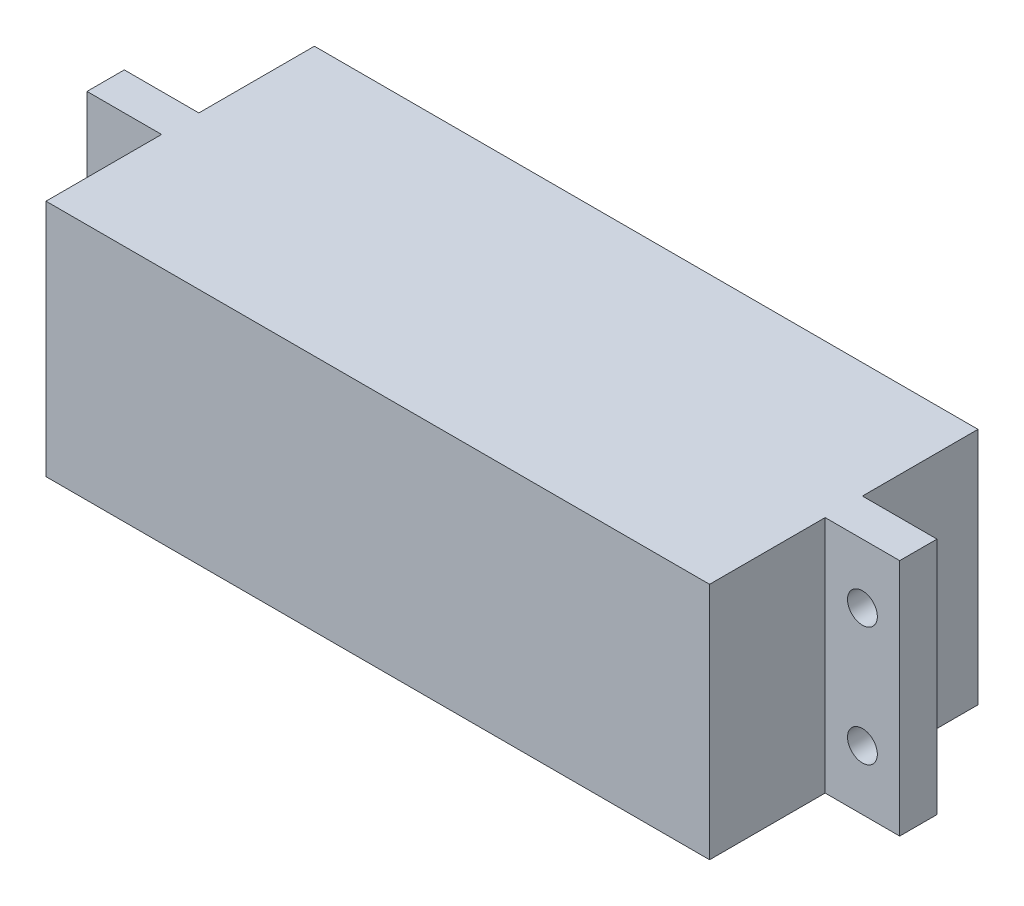
ISO-10303-21;
HEADER;
FILE_DESCRIPTION(('STEP AP214'),'2;1');
FILE_NAME('part.step','',(''),(''),'','','');
FILE_SCHEMA(('AUTOMOTIVE_DESIGN { 1 0 10303 214 1 1 1 1 }'));
ENDSEC;
DATA;
#1=APPLICATION_CONTEXT('core data for automotive mechanical design processes');
#2=APPLICATION_PROTOCOL_DEFINITION('international standard','automotive_design',2000,#1);
#3=PRODUCT_CONTEXT('',#1,'mechanical');
#4=PRODUCT('Part','Part','',(#3));
#5=PRODUCT_RELATED_PRODUCT_CATEGORY('part','',(#4));
#6=PRODUCT_DEFINITION_FORMATION('','',#4);
#7=PRODUCT_DEFINITION_CONTEXT('part definition',#1,'design');
#8=PRODUCT_DEFINITION('design','',#6,#7);
#9=PRODUCT_DEFINITION_SHAPE('','',#8);
#10=(LENGTH_UNIT() NAMED_UNIT(*) SI_UNIT(.MILLI.,.METRE.));
#11=(NAMED_UNIT(*) PLANE_ANGLE_UNIT() SI_UNIT($,.RADIAN.));
#12=(NAMED_UNIT(*) SI_UNIT($,.STERADIAN.) SOLID_ANGLE_UNIT());
#13=UNCERTAINTY_MEASURE_WITH_UNIT(LENGTH_MEASURE(1.E-05),#10,'distance_accuracy_value','');
#14=(GEOMETRIC_REPRESENTATION_CONTEXT(3) GLOBAL_UNCERTAINTY_ASSIGNED_CONTEXT((#13)) GLOBAL_UNIT_ASSIGNED_CONTEXT((#10,
#11,#12)) REPRESENTATION_CONTEXT('',''));
#15=CARTESIAN_POINT('',(0.,0.,0.));
#16=DIRECTION('',(0.,0.,1.));
#17=DIRECTION('',(1.,0.,0.));
#18=AXIS2_PLACEMENT_3D('',#15,#16,#17);
#19=CARTESIAN_POINT('',(-44.5,-30.,0.));
#20=DIRECTION('',(-1.,0.,0.));
#21=DIRECTION('',(0.,0.,1.));
#22=AXIS2_PLACEMENT_3D('',#19,#20,#21);
#23=PLANE('',#22);
#24=DIRECTION('',(0.,0.,-1.));
#25=VECTOR('',#24,1.);
#26=CARTESIAN_POINT('',(-44.5,2.,0.));
#27=LINE('',#26,#25);
#28=CARTESIAN_POINT('',(-44.5,2.,18.));
#29=VERTEX_POINT('',#28);
#30=CARTESIAN_POINT('',(-44.5,2.,2.5));
#31=VERTEX_POINT('',#30);
#32=EDGE_CURVE('E305',#29,#31,#27,.T.);
#33=ORIENTED_EDGE('',*,*,#32,.T.);
#34=DIRECTION('',(0.,-1.,0.));
#35=VECTOR('',#34,1.);
#36=CARTESIAN_POINT('',(-44.5,2.,2.5));
#37=LINE('',#36,#35);
#38=CARTESIAN_POINT('',(-44.5,-30.,2.5));
#39=VERTEX_POINT('',#38);
#40=EDGE_CURVE('E210',#31,#39,#37,.T.);
#41=ORIENTED_EDGE('',*,*,#40,.T.);
#42=DIRECTION('',(0.,0.,1.));
#43=VECTOR('',#42,1.);
#44=CARTESIAN_POINT('',(-44.5,-30.,0.));
#45=LINE('',#44,#43);
#46=CARTESIAN_POINT('',(-44.5,-30.,18.));
#47=VERTEX_POINT('',#46);
#48=EDGE_CURVE('E352',#39,#47,#45,.T.);
#49=ORIENTED_EDGE('',*,*,#48,.T.);
#50=DIRECTION('',(0.,1.,0.));
#51=VECTOR('',#50,1.);
#52=CARTESIAN_POINT('',(-44.5,-30.,18.));
#53=LINE('',#52,#51);
#54=EDGE_CURVE('E367',#47,#29,#53,.T.);
#55=ORIENTED_EDGE('',*,*,#54,.T.);
#56=EDGE_LOOP('',(#33,#41,#49,#55));
#57=FACE_BOUND('',#56,.T.);
#58=ADVANCED_FACE('F87',(#57),#23,.T.);
#59=CARTESIAN_POINT('',(-44.5,-30.,-18.));
#60=VERTEX_POINT('',#59);
#61=CARTESIAN_POINT('',(-44.5,-30.,-2.5));
#62=VERTEX_POINT('',#61);
#63=EDGE_CURVE('E353',#60,#62,#45,.T.);
#64=ORIENTED_EDGE('',*,*,#63,.T.);
#65=DIRECTION('',(0.,1.,0.));
#66=VECTOR('',#65,1.);
#67=CARTESIAN_POINT('',(-44.5,2.,-2.5));
#68=LINE('',#67,#66);
#69=CARTESIAN_POINT('',(-44.5,2.,-2.5));
#70=VERTEX_POINT('',#69);
#71=EDGE_CURVE('E226',#62,#70,#68,.T.);
#72=ORIENTED_EDGE('',*,*,#71,.T.);
#73=CARTESIAN_POINT('',(-44.5,2.,-18.));
#74=VERTEX_POINT('',#73);
#75=EDGE_CURVE('E304',#70,#74,#27,.T.);
#76=ORIENTED_EDGE('',*,*,#75,.T.);
#77=DIRECTION('',(0.,1.,0.));
#78=VECTOR('',#77,1.);
#79=CARTESIAN_POINT('',(-44.5,-30.,-18.));
#80=LINE('',#79,#78);
#81=EDGE_CURVE('E370',#60,#74,#80,.T.);
#82=ORIENTED_EDGE('',*,*,#81,.F.);
#83=EDGE_LOOP('',(#64,#72,#76,#82));
#84=FACE_BOUND('',#83,.T.);
#85=ADVANCED_FACE('F424',(#84),#23,.T.);
#86=CARTESIAN_POINT('',(44.5,-30.,0.));
#87=DIRECTION('',(1.,0.,0.));
#88=DIRECTION('',(0.,0.,-1.));
#89=AXIS2_PLACEMENT_3D('',#86,#87,#88);
#90=PLANE('',#89);
#91=DIRECTION('',(0.,-1.,0.));
#92=VECTOR('',#91,1.);
#93=CARTESIAN_POINT('',(44.5,2.,2.5));
#94=LINE('',#93,#92);
#95=CARTESIAN_POINT('',(44.5,2.,2.5));
#96=VERTEX_POINT('',#95);
#97=CARTESIAN_POINT('',(44.5,-30.,2.5));
#98=VERTEX_POINT('',#97);
#99=EDGE_CURVE('E274',#96,#98,#94,.T.);
#100=ORIENTED_EDGE('',*,*,#99,.F.);
#101=DIRECTION('',(0.,0.,1.));
#102=VECTOR('',#101,1.);
#103=CARTESIAN_POINT('',(44.5,2.,0.));
#104=LINE('',#103,#102);
#105=CARTESIAN_POINT('',(44.5,2.,18.));
#106=VERTEX_POINT('',#105);
#107=EDGE_CURVE('E296',#96,#106,#104,.T.);
#108=ORIENTED_EDGE('',*,*,#107,.T.);
#109=DIRECTION('',(0.,1.,0.));
#110=VECTOR('',#109,1.);
#111=CARTESIAN_POINT('',(44.5,-30.,18.));
#112=LINE('',#111,#110);
#113=CARTESIAN_POINT('',(44.5,-30.,18.));
#114=VERTEX_POINT('',#113);
#115=EDGE_CURVE('E362',#114,#106,#112,.T.);
#116=ORIENTED_EDGE('',*,*,#115,.F.);
#117=DIRECTION('',(0.,0.,-1.));
#118=VECTOR('',#117,1.);
#119=CARTESIAN_POINT('',(44.5,-30.,0.));
#120=LINE('',#119,#118);
#121=EDGE_CURVE('E345',#114,#98,#120,.T.);
#122=ORIENTED_EDGE('',*,*,#121,.T.);
#123=EDGE_LOOP('',(#100,#108,#116,#122));
#124=FACE_BOUND('',#123,.T.);
#125=ADVANCED_FACE('F430',(#124),#90,.T.);
#126=CARTESIAN_POINT('',(0.,2.,0.));
#127=DIRECTION('',(0.,-1.,0.));
#128=DIRECTION('',(0.,0.,-1.));
#129=AXIS2_PLACEMENT_3D('',#126,#127,#128);
#130=PLANE('',#129);
#131=DIRECTION('',(1.,0.,0.));
#132=VECTOR('',#131,1.);
#133=CARTESIAN_POINT('',(0.,2.,-18.));
#134=LINE('',#133,#132);
#135=CARTESIAN_POINT('',(44.5,2.,-18.));
#136=VERTEX_POINT('',#135);
#137=EDGE_CURVE('E300',#74,#136,#134,.T.);
#138=ORIENTED_EDGE('',*,*,#137,.F.);
#139=ORIENTED_EDGE('',*,*,#75,.F.);
#140=DIRECTION('',(1.,0.,0.));
#141=VECTOR('',#140,1.);
#142=CARTESIAN_POINT('',(-54.5,2.,-2.5));
#143=LINE('',#142,#141);
#144=CARTESIAN_POINT('',(-54.5,2.,-2.5));
#145=VERTEX_POINT('',#144);
#146=EDGE_CURVE('E105',#145,#70,#143,.T.);
#147=ORIENTED_EDGE('',*,*,#146,.F.);
#148=DIRECTION('',(0.,0.,1.));
#149=VECTOR('',#148,1.);
#150=CARTESIAN_POINT('',(-54.5,2.,2.5));
#151=LINE('',#150,#149);
#152=CARTESIAN_POINT('',(-54.5,2.,2.5));
#153=VERTEX_POINT('',#152);
#154=EDGE_CURVE('E222',#145,#153,#151,.T.);
#155=ORIENTED_EDGE('',*,*,#154,.T.);
#156=DIRECTION('',(1.,0.,0.));
#157=VECTOR('',#156,1.);
#158=CARTESIAN_POINT('',(-54.5,2.,2.5));
#159=LINE('',#158,#157);
#160=EDGE_CURVE('E204',#153,#31,#159,.T.);
#161=ORIENTED_EDGE('',*,*,#160,.T.);
#162=ORIENTED_EDGE('',*,*,#32,.F.);
#163=DIRECTION('',(-1.,0.,0.));
#164=VECTOR('',#163,1.);
#165=CARTESIAN_POINT('',(0.,2.,18.));
#166=LINE('',#165,#164);
#167=EDGE_CURVE('E308',#106,#29,#166,.T.);
#168=ORIENTED_EDGE('',*,*,#167,.F.);
#169=ORIENTED_EDGE('',*,*,#107,.F.);
#170=DIRECTION('',(-1.,0.,0.));
#171=VECTOR('',#170,1.);
#172=CARTESIAN_POINT('',(54.5,2.,2.5));
#173=LINE('',#172,#171);
#174=CARTESIAN_POINT('',(54.5,2.,2.5));
#175=VERTEX_POINT('',#174);
#176=EDGE_CURVE('E273',#175,#96,#173,.T.);
#177=ORIENTED_EDGE('',*,*,#176,.F.);
#178=DIRECTION('',(0.,0.,1.));
#179=VECTOR('',#178,1.);
#180=CARTESIAN_POINT('',(54.5,2.,2.5));
#181=LINE('',#180,#179);
#182=CARTESIAN_POINT('',(54.5,2.,-2.5));
#183=VERTEX_POINT('',#182);
#184=EDGE_CURVE('E270',#183,#175,#181,.T.);
#185=ORIENTED_EDGE('',*,*,#184,.F.);
#186=DIRECTION('',(-1.,0.,0.));
#187=VECTOR('',#186,1.);
#188=CARTESIAN_POINT('',(54.5,2.,-2.5));
#189=LINE('',#188,#187);
#190=CARTESIAN_POINT('',(44.5,2.,-2.5));
#191=VERTEX_POINT('',#190);
#192=EDGE_CURVE('E284',#183,#191,#189,.T.);
#193=ORIENTED_EDGE('',*,*,#192,.T.);
#194=EDGE_CURVE('E297',#136,#191,#104,.T.);
#195=ORIENTED_EDGE('',*,*,#194,.F.);
#196=EDGE_LOOP('',(#138,#139,#147,#155,#161,#162,#168,#169,#177,#185,#193,#195));
#197=FACE_BOUND('',#196,.T.);
#198=ADVANCED_FACE('F229',(#197),#130,.F.);
#199=DIRECTION('',(0.,1.,0.));
#200=VECTOR('',#199,1.);
#201=CARTESIAN_POINT('',(44.5,2.,-2.5));
#202=LINE('',#201,#200);
#203=CARTESIAN_POINT('',(44.5,-30.,-2.5));
#204=VERTEX_POINT('',#203);
#205=EDGE_CURVE('E113',#204,#191,#202,.T.);
#206=ORIENTED_EDGE('',*,*,#205,.F.);
#207=CARTESIAN_POINT('',(44.5,-30.,-18.));
#208=VERTEX_POINT('',#207);
#209=EDGE_CURVE('E333',#204,#208,#120,.T.);
#210=ORIENTED_EDGE('',*,*,#209,.T.);
#211=DIRECTION('',(0.,1.,0.));
#212=VECTOR('',#211,1.);
#213=CARTESIAN_POINT('',(44.5,-30.,-18.));
#214=LINE('',#213,#212);
#215=EDGE_CURVE('E361',#208,#136,#214,.T.);
#216=ORIENTED_EDGE('',*,*,#215,.T.);
#217=ORIENTED_EDGE('',*,*,#194,.T.);
#218=EDGE_LOOP('',(#206,#210,#216,#217));
#219=FACE_BOUND('',#218,.T.);
#220=ADVANCED_FACE('F441',(#219),#90,.T.);
#221=CARTESIAN_POINT('',(0.,-30.,18.));
#222=DIRECTION('',(0.,0.,1.));
#223=DIRECTION('',(1.,0.,0.));
#224=AXIS2_PLACEMENT_3D('',#221,#222,#223);
#225=PLANE('',#224);
#226=ORIENTED_EDGE('',*,*,#115,.T.);
#227=ORIENTED_EDGE('',*,*,#167,.T.);
#228=ORIENTED_EDGE('',*,*,#54,.F.);
#229=DIRECTION('',(1.,0.,0.));
#230=VECTOR('',#229,1.);
#231=CARTESIAN_POINT('',(0.,-30.,18.));
#232=LINE('',#231,#230);
#233=EDGE_CURVE('E357',#47,#114,#232,.T.);
#234=ORIENTED_EDGE('',*,*,#233,.T.);
#235=EDGE_LOOP('',(#226,#227,#228,#234));
#236=FACE_BOUND('',#235,.T.);
#237=ADVANCED_FACE('F434',(#236),#225,.T.);
#238=CARTESIAN_POINT('',(0.,-30.,-18.));
#239=DIRECTION('',(0.,0.,-1.));
#240=DIRECTION('',(-1.,0.,0.));
#241=AXIS2_PLACEMENT_3D('',#238,#239,#240);
#242=PLANE('',#241);
#243=ORIENTED_EDGE('',*,*,#81,.T.);
#244=ORIENTED_EDGE('',*,*,#137,.T.);
#245=ORIENTED_EDGE('',*,*,#215,.F.);
#246=DIRECTION('',(-1.,0.,0.));
#247=VECTOR('',#246,1.);
#248=CARTESIAN_POINT('',(0.,-30.,-18.));
#249=LINE('',#248,#247);
#250=EDGE_CURVE('E348',#208,#60,#249,.T.);
#251=ORIENTED_EDGE('',*,*,#250,.T.);
#252=EDGE_LOOP('',(#243,#244,#245,#251));
#253=FACE_BOUND('',#252,.T.);
#254=ADVANCED_FACE('F436',(#253),#242,.T.);
#255=CARTESIAN_POINT('',(0.,-30.,0.));
#256=DIRECTION('',(0.,1.,0.));
#257=DIRECTION('',(0.,0.,1.));
#258=AXIS2_PLACEMENT_3D('',#255,#256,#257);
#259=PLANE('',#258);
#260=DIRECTION('',(1.,0.,0.));
#261=VECTOR('',#260,1.);
#262=CARTESIAN_POINT('',(-42.5,-30.,16.));
#263=LINE('',#262,#261);
#264=CARTESIAN_POINT('',(-42.5,-30.,16.));
#265=VERTEX_POINT('',#264);
#266=CARTESIAN_POINT('',(42.5,-30.,16.));
#267=VERTEX_POINT('',#266);
#268=EDGE_CURVE('E324',#265,#267,#263,.T.);
#269=ORIENTED_EDGE('',*,*,#268,.T.);
#270=DIRECTION('',(0.,0.,-1.));
#271=VECTOR('',#270,1.);
#272=CARTESIAN_POINT('',(42.5,-30.,16.));
#273=LINE('',#272,#271);
#274=CARTESIAN_POINT('',(42.5,-30.,-16.));
#275=VERTEX_POINT('',#274);
#276=EDGE_CURVE('E312',#267,#275,#273,.T.);
#277=ORIENTED_EDGE('',*,*,#276,.T.);
#278=DIRECTION('',(-1.,0.,0.));
#279=VECTOR('',#278,1.);
#280=CARTESIAN_POINT('',(-42.5,-30.,-16.));
#281=LINE('',#280,#279);
#282=CARTESIAN_POINT('',(-42.5,-30.,-16.));
#283=VERTEX_POINT('',#282);
#284=EDGE_CURVE('E316',#275,#283,#281,.T.);
#285=ORIENTED_EDGE('',*,*,#284,.T.);
#286=DIRECTION('',(0.,0.,1.));
#287=VECTOR('',#286,1.);
#288=CARTESIAN_POINT('',(-42.5,-30.,16.));
#289=LINE('',#288,#287);
#290=EDGE_CURVE('E320',#283,#265,#289,.T.);
#291=ORIENTED_EDGE('',*,*,#290,.T.);
#292=EDGE_LOOP('',(#269,#277,#285,#291));
#293=FACE_BOUND('',#292,.T.);
#294=ORIENTED_EDGE('',*,*,#121,.F.);
#295=ORIENTED_EDGE('',*,*,#233,.F.);
#296=ORIENTED_EDGE('',*,*,#48,.F.);
#297=DIRECTION('',(1.,0.,0.));
#298=VECTOR('',#297,1.);
#299=CARTESIAN_POINT('',(-54.5,-30.,2.5));
#300=LINE('',#299,#298);
#301=CARTESIAN_POINT('',(-54.5,-30.,2.5));
#302=VERTEX_POINT('',#301);
#303=EDGE_CURVE('E240',#302,#39,#300,.T.);
#304=ORIENTED_EDGE('',*,*,#303,.F.);
#305=DIRECTION('',(0.,0.,-1.));
#306=VECTOR('',#305,1.);
#307=CARTESIAN_POINT('',(-54.5,-30.,2.5));
#308=LINE('',#307,#306);
#309=CARTESIAN_POINT('',(-54.5,-30.,-2.5));
#310=VERTEX_POINT('',#309);
#311=EDGE_CURVE('E224',#302,#310,#308,.T.);
#312=ORIENTED_EDGE('',*,*,#311,.T.);
#313=DIRECTION('',(1.,0.,0.));
#314=VECTOR('',#313,1.);
#315=CARTESIAN_POINT('',(-54.5,-30.,-2.5));
#316=LINE('',#315,#314);
#317=EDGE_CURVE('E247',#310,#62,#316,.T.);
#318=ORIENTED_EDGE('',*,*,#317,.T.);
#319=ORIENTED_EDGE('',*,*,#63,.F.);
#320=ORIENTED_EDGE('',*,*,#250,.F.);
#321=ORIENTED_EDGE('',*,*,#209,.F.);
#322=DIRECTION('',(-1.,0.,0.));
#323=VECTOR('',#322,1.);
#324=CARTESIAN_POINT('',(54.5,-30.,-2.5));
#325=LINE('',#324,#323);
#326=CARTESIAN_POINT('',(54.5,-30.,-2.5));
#327=VERTEX_POINT('',#326);
#328=EDGE_CURVE('E288',#327,#204,#325,.T.);
#329=ORIENTED_EDGE('',*,*,#328,.F.);
#330=DIRECTION('',(0.,0.,-1.));
#331=VECTOR('',#330,1.);
#332=CARTESIAN_POINT('',(54.5,-30.,2.5));
#333=LINE('',#332,#331);
#334=CARTESIAN_POINT('',(54.5,-30.,2.5));
#335=VERTEX_POINT('',#334);
#336=EDGE_CURVE('E264',#335,#327,#333,.T.);
#337=ORIENTED_EDGE('',*,*,#336,.F.);
#338=DIRECTION('',(-1.,0.,0.));
#339=VECTOR('',#338,1.);
#340=CARTESIAN_POINT('',(54.5,-30.,2.5));
#341=LINE('',#340,#339);
#342=EDGE_CURVE('E292',#335,#98,#341,.T.);
#343=ORIENTED_EDGE('',*,*,#342,.T.);
#344=EDGE_LOOP('',(#294,#295,#296,#304,#312,#318,#319,#320,#321,#329,#337,#343));
#345=FACE_BOUND('',#344,.T.);
#346=ADVANCED_FACE('F439',(#293,#345),#259,.F.);
#347=CARTESIAN_POINT('',(42.5,-30.,16.));
#348=DIRECTION('',(1.,0.,0.));
#349=DIRECTION('',(0.,0.,-1.));
#350=AXIS2_PLACEMENT_3D('',#347,#348,#349);
#351=PLANE('',#350);
#352=DIRECTION('',(0.,0.,-1.));
#353=VECTOR('',#352,1.);
#354=CARTESIAN_POINT('',(42.5,0.,16.));
#355=LINE('',#354,#353);
#356=CARTESIAN_POINT('',(42.5,0.,16.));
#357=VERTEX_POINT('',#356);
#358=CARTESIAN_POINT('',(42.5,0.,-16.));
#359=VERTEX_POINT('',#358);
#360=EDGE_CURVE('E366',#357,#359,#355,.T.);
#361=ORIENTED_EDGE('',*,*,#360,.T.);
#362=DIRECTION('',(0.,1.,0.));
#363=VECTOR('',#362,1.);
#364=CARTESIAN_POINT('',(42.5,-30.,-16.));
#365=LINE('',#364,#363);
#366=EDGE_CURVE('E328',#275,#359,#365,.T.);
#367=ORIENTED_EDGE('',*,*,#366,.F.);
#368=ORIENTED_EDGE('',*,*,#276,.F.);
#369=DIRECTION('',(0.,1.,0.));
#370=VECTOR('',#369,1.);
#371=CARTESIAN_POINT('',(42.5,-30.,16.));
#372=LINE('',#371,#370);
#373=EDGE_CURVE('E329',#267,#357,#372,.T.);
#374=ORIENTED_EDGE('',*,*,#373,.T.);
#375=EDGE_LOOP('',(#361,#367,#368,#374));
#376=FACE_BOUND('',#375,.T.);
#377=ADVANCED_FACE('F494',(#376),#351,.F.);
#378=CARTESIAN_POINT('',(-42.5,-30.,16.));
#379=DIRECTION('',(0.,0.,1.));
#380=DIRECTION('',(1.,0.,0.));
#381=AXIS2_PLACEMENT_3D('',#378,#379,#380);
#382=PLANE('',#381);
#383=DIRECTION('',(1.,0.,0.));
#384=VECTOR('',#383,1.);
#385=CARTESIAN_POINT('',(-42.5,0.,16.));
#386=LINE('',#385,#384);
#387=CARTESIAN_POINT('',(-42.5,0.,16.));
#388=VERTEX_POINT('',#387);
#389=EDGE_CURVE('E12',#388,#357,#386,.T.);
#390=ORIENTED_EDGE('',*,*,#389,.T.);
#391=ORIENTED_EDGE('',*,*,#373,.F.);
#392=ORIENTED_EDGE('',*,*,#268,.F.);
#393=DIRECTION('',(0.,1.,0.));
#394=VECTOR('',#393,1.);
#395=CARTESIAN_POINT('',(-42.5,-30.,16.));
#396=LINE('',#395,#394);
#397=EDGE_CURVE('E334',#265,#388,#396,.T.);
#398=ORIENTED_EDGE('',*,*,#397,.T.);
#399=EDGE_LOOP('',(#390,#391,#392,#398));
#400=FACE_BOUND('',#399,.T.);
#401=ADVANCED_FACE('F501',(#400),#382,.F.);
#402=CARTESIAN_POINT('',(-42.5,-30.,16.));
#403=DIRECTION('',(-1.,0.,0.));
#404=DIRECTION('',(0.,0.,1.));
#405=AXIS2_PLACEMENT_3D('',#402,#403,#404);
#406=PLANE('',#405);
#407=DIRECTION('',(0.,0.,1.));
#408=VECTOR('',#407,1.);
#409=CARTESIAN_POINT('',(-42.5,0.,16.));
#410=LINE('',#409,#408);
#411=CARTESIAN_POINT('',(-42.5,0.,-16.));
#412=VERTEX_POINT('',#411);
#413=EDGE_CURVE('E97',#412,#388,#410,.T.);
#414=ORIENTED_EDGE('',*,*,#413,.T.);
#415=ORIENTED_EDGE('',*,*,#397,.F.);
#416=ORIENTED_EDGE('',*,*,#290,.F.);
#417=DIRECTION('',(0.,1.,0.));
#418=VECTOR('',#417,1.);
#419=CARTESIAN_POINT('',(-42.5,-30.,-16.));
#420=LINE('',#419,#418);
#421=EDGE_CURVE('E338',#283,#412,#420,.T.);
#422=ORIENTED_EDGE('',*,*,#421,.T.);
#423=EDGE_LOOP('',(#414,#415,#416,#422));
#424=FACE_BOUND('',#423,.T.);
#425=ADVANCED_FACE('F509',(#424),#406,.F.);
#426=CARTESIAN_POINT('',(-42.5,-30.,-16.));
#427=DIRECTION('',(0.,0.,-1.));
#428=DIRECTION('',(-1.,0.,0.));
#429=AXIS2_PLACEMENT_3D('',#426,#427,#428);
#430=PLANE('',#429);
#431=DIRECTION('',(-1.,0.,0.));
#432=VECTOR('',#431,1.);
#433=CARTESIAN_POINT('',(-42.5,0.,-16.));
#434=LINE('',#433,#432);
#435=EDGE_CURVE('E379',#359,#412,#434,.T.);
#436=ORIENTED_EDGE('',*,*,#435,.T.);
#437=ORIENTED_EDGE('',*,*,#421,.F.);
#438=ORIENTED_EDGE('',*,*,#284,.F.);
#439=ORIENTED_EDGE('',*,*,#366,.T.);
#440=EDGE_LOOP('',(#436,#437,#438,#439));
#441=FACE_BOUND('',#440,.T.);
#442=ADVANCED_FACE('F517',(#441),#430,.F.);
#443=CARTESIAN_POINT('',(0.,0.,0.));
#444=DIRECTION('',(0.,-1.,0.));
#445=DIRECTION('',(0.,0.,-1.));
#446=AXIS2_PLACEMENT_3D('',#443,#444,#445);
#447=PLANE('',#446);
#448=ORIENTED_EDGE('',*,*,#360,.F.);
#449=ORIENTED_EDGE('',*,*,#389,.F.);
#450=ORIENTED_EDGE('',*,*,#413,.F.);
#451=ORIENTED_EDGE('',*,*,#435,.F.);
#452=EDGE_LOOP('',(#448,#449,#450,#451));
#453=FACE_BOUND('',#452,.T.);
#454=ADVANCED_FACE('F89',(#453),#447,.T.);
#455=CARTESIAN_POINT('',(54.5,2.,2.5));
#456=DIRECTION('',(0.,0.,-1.));
#457=DIRECTION('',(0.,1.,0.));
#458=AXIS2_PLACEMENT_3D('',#455,#456,#457);
#459=PLANE('',#458);
#460=CARTESIAN_POINT('',(49.5,-6.,2.5));
#461=DIRECTION('',(0.,0.,1.));
#462=DIRECTION('',(1.,0.,0.));
#463=AXIS2_PLACEMENT_3D('',#460,#461,#462);
#464=CIRCLE('',#463,2.);
#465=CARTESIAN_POINT('',(51.5,-6.,2.50000000000001));
#466=VERTEX_POINT('',#465);
#467=EDGE_CURVE('E252',#466,#466,#464,.T.);
#468=ORIENTED_EDGE('',*,*,#467,.F.);
#469=EDGE_LOOP('',(#468));
#470=FACE_BOUND('',#469,.T.);
#471=CARTESIAN_POINT('',(49.5,-22.,2.5));
#472=DIRECTION('',(0.,0.,1.));
#473=DIRECTION('',(-1.,0.,0.));
#474=AXIS2_PLACEMENT_3D('',#471,#472,#473);
#475=CIRCLE('',#474,2.);
#476=CARTESIAN_POINT('',(51.5,-22.,2.50000000000001));
#477=VERTEX_POINT('',#476);
#478=EDGE_CURVE('E216',#477,#477,#475,.T.);
#479=ORIENTED_EDGE('',*,*,#478,.F.);
#480=EDGE_LOOP('',(#479));
#481=FACE_BOUND('',#480,.T.);
#482=ORIENTED_EDGE('',*,*,#99,.T.);
#483=ORIENTED_EDGE('',*,*,#342,.F.);
#484=DIRECTION('',(0.,-1.,0.));
#485=VECTOR('',#484,1.);
#486=CARTESIAN_POINT('',(54.5,2.,2.5));
#487=LINE('',#486,#485);
#488=EDGE_CURVE('E260',#175,#335,#487,.T.);
#489=ORIENTED_EDGE('',*,*,#488,.F.);
#490=ORIENTED_EDGE('',*,*,#176,.T.);
#491=EDGE_LOOP('',(#482,#483,#489,#490));
#492=FACE_BOUND('',#491,.T.);
#493=ADVANCED_FACE('F459',(#470,#481,#492),#459,.F.);
#494=CARTESIAN_POINT('',(54.5,2.,-2.5));
#495=DIRECTION('',(0.,0.,1.));
#496=DIRECTION('',(0.,-1.,0.));
#497=AXIS2_PLACEMENT_3D('',#494,#495,#496);
#498=PLANE('',#497);
#499=CARTESIAN_POINT('',(49.5,-6.,-2.5));
#500=DIRECTION('',(0.,0.,1.));
#501=DIRECTION('',(0.,-1.,0.));
#502=AXIS2_PLACEMENT_3D('',#499,#500,#501);
#503=CIRCLE('',#502,2.);
#504=CARTESIAN_POINT('',(51.5,-6.,-2.5));
#505=VERTEX_POINT('',#504);
#506=EDGE_CURVE('E278',#505,#505,#503,.T.);
#507=ORIENTED_EDGE('',*,*,#506,.T.);
#508=EDGE_LOOP('',(#507));
#509=FACE_BOUND('',#508,.T.);
#510=CARTESIAN_POINT('',(49.5,-22.,-2.5));
#511=DIRECTION('',(0.,0.,1.));
#512=DIRECTION('',(0.,-1.,0.));
#513=AXIS2_PLACEMENT_3D('',#510,#511,#512);
#514=CIRCLE('',#513,2.);
#515=CARTESIAN_POINT('',(51.5,-22.,-2.5));
#516=VERTEX_POINT('',#515);
#517=EDGE_CURVE('E256',#516,#516,#514,.T.);
#518=ORIENTED_EDGE('',*,*,#517,.T.);
#519=EDGE_LOOP('',(#518));
#520=FACE_BOUND('',#519,.T.);
#521=ORIENTED_EDGE('',*,*,#205,.T.);
#522=ORIENTED_EDGE('',*,*,#192,.F.);
#523=DIRECTION('',(0.,1.,0.));
#524=VECTOR('',#523,1.);
#525=CARTESIAN_POINT('',(54.5,2.,-2.5));
#526=LINE('',#525,#524);
#527=EDGE_CURVE('E267',#327,#183,#526,.T.);
#528=ORIENTED_EDGE('',*,*,#527,.F.);
#529=ORIENTED_EDGE('',*,*,#328,.T.);
#530=EDGE_LOOP('',(#521,#522,#528,#529));
#531=FACE_BOUND('',#530,.T.);
#532=ADVANCED_FACE('F467',(#509,#520,#531),#498,.F.);
#533=CARTESIAN_POINT('',(54.5,0.,0.));
#534=DIRECTION('',(1.,0.,0.));
#535=DIRECTION('',(0.,0.,-1.));
#536=AXIS2_PLACEMENT_3D('',#533,#534,#535);
#537=PLANE('',#536);
#538=ORIENTED_EDGE('',*,*,#488,.T.);
#539=ORIENTED_EDGE('',*,*,#336,.T.);
#540=ORIENTED_EDGE('',*,*,#527,.T.);
#541=ORIENTED_EDGE('',*,*,#184,.T.);
#542=EDGE_LOOP('',(#538,#539,#540,#541));
#543=FACE_BOUND('',#542,.T.);
#544=ADVANCED_FACE('F461',(#543),#537,.T.);
#545=CARTESIAN_POINT('',(49.5,-22.,-18.));
#546=DIRECTION('',(0.,0.,1.));
#547=DIRECTION('',(1.,0.,0.));
#548=AXIS2_PLACEMENT_3D('',#545,#546,#547);
#549=CYLINDRICAL_SURFACE('',#548,2.);
#550=CARTESIAN_POINT('',(51.5,-22.,2.50000000000001));
#551=CARTESIAN_POINT('',(51.5,-22.,2.44791666666667));
#552=CARTESIAN_POINT('',(51.5,-22.,2.39583333333334));
#553=CARTESIAN_POINT('',(51.5,-22.,2.29166666666667));
#554=CARTESIAN_POINT('',(51.5,-22.,2.23958333333334));
#555=CARTESIAN_POINT('',(51.5,-22.,2.13541666666667));
#556=CARTESIAN_POINT('',(51.5,-22.,2.08333333333334));
#557=CARTESIAN_POINT('',(51.5,-22.,1.97916666666667));
#558=CARTESIAN_POINT('',(51.5,-22.,1.92708333333334));
#559=CARTESIAN_POINT('',(51.5,-22.,1.82291666666667));
#560=CARTESIAN_POINT('',(51.5,-22.,1.77083333333334));
#561=CARTESIAN_POINT('',(51.5,-22.,1.66666666666667));
#562=CARTESIAN_POINT('',(51.5,-22.,1.61458333333334));
#563=CARTESIAN_POINT('',(51.5,-22.,1.51041666666667));
#564=CARTESIAN_POINT('',(51.5,-22.,1.45833333333334));
#565=CARTESIAN_POINT('',(51.5,-22.,1.35416666666667));
#566=CARTESIAN_POINT('',(51.5,-22.,1.30208333333334));
#567=CARTESIAN_POINT('',(51.5,-22.,1.19791666666667));
#568=CARTESIAN_POINT('',(51.5,-22.,1.14583333333334));
#569=CARTESIAN_POINT('',(51.5,-22.,1.04166666666667));
#570=CARTESIAN_POINT('',(51.5,-22.,0.989583333333338));
#571=CARTESIAN_POINT('',(51.5,-22.,0.885416666666671));
#572=CARTESIAN_POINT('',(51.5,-22.,0.833333333333337));
#573=CARTESIAN_POINT('',(51.5,-22.,0.729166666666671));
#574=CARTESIAN_POINT('',(51.5,-22.,0.677083333333337));
#575=CARTESIAN_POINT('',(51.5,-22.,0.572916666666671));
#576=CARTESIAN_POINT('',(51.5,-22.,0.520833333333337));
#577=CARTESIAN_POINT('',(51.5,-22.,0.416666666666671));
#578=CARTESIAN_POINT('',(51.5,-22.,0.364583333333337));
#579=CARTESIAN_POINT('',(51.5,-22.,0.260416666666669));
#580=CARTESIAN_POINT('',(51.5,-22.,0.208333333333335));
#581=CARTESIAN_POINT('',(51.5,-22.,0.104166666666668));
#582=CARTESIAN_POINT('',(51.5,-22.,0.0520833333333357));
#583=CARTESIAN_POINT('',(51.5,-22.,-0.0520833333333311));
#584=CARTESIAN_POINT('',(51.5,-22.,-0.104166666666666));
#585=CARTESIAN_POINT('',(51.5,-22.,-0.208333333333332));
#586=CARTESIAN_POINT('',(51.5,-22.,-0.260416666666665));
#587=CARTESIAN_POINT('',(51.5,-22.,-0.364583333333331));
#588=CARTESIAN_POINT('',(51.5,-22.,-0.416666666666666));
#589=CARTESIAN_POINT('',(51.5,-22.,-0.520833333333334));
#590=CARTESIAN_POINT('',(51.5,-22.,-0.572916666666667));
#591=CARTESIAN_POINT('',(51.5,-22.,-0.677083333333334));
#592=CARTESIAN_POINT('',(51.5,-22.,-0.729166666666667));
#593=CARTESIAN_POINT('',(51.5,-22.,-0.833333333333334));
#594=CARTESIAN_POINT('',(51.5,-22.,-0.885416666666668));
#595=CARTESIAN_POINT('',(51.5,-22.,-0.989583333333334));
#596=CARTESIAN_POINT('',(51.5,-22.,-1.04166666666667));
#597=CARTESIAN_POINT('',(51.5,-22.,-1.14583333333333));
#598=CARTESIAN_POINT('',(51.5,-22.,-1.19791666666667));
#599=CARTESIAN_POINT('',(51.5,-22.,-1.30208333333333));
#600=CARTESIAN_POINT('',(51.5,-22.,-1.35416666666667));
#601=CARTESIAN_POINT('',(51.5,-22.,-1.45833333333333));
#602=CARTESIAN_POINT('',(51.5,-22.,-1.51041666666667));
#603=CARTESIAN_POINT('',(51.5,-22.,-1.61458333333333));
#604=CARTESIAN_POINT('',(51.5,-22.,-1.66666666666667));
#605=CARTESIAN_POINT('',(51.5,-22.,-1.77083333333334));
#606=CARTESIAN_POINT('',(51.5,-22.,-1.82291666666667));
#607=CARTESIAN_POINT('',(51.5,-22.,-1.92708333333334));
#608=CARTESIAN_POINT('',(51.5,-22.,-1.97916666666667));
#609=CARTESIAN_POINT('',(51.5,-22.,-2.08333333333334));
#610=CARTESIAN_POINT('',(51.5,-22.,-2.13541666666667));
#611=CARTESIAN_POINT('',(51.5,-22.,-2.23958333333334));
#612=CARTESIAN_POINT('',(51.5,-22.,-2.29166666666667));
#613=CARTESIAN_POINT('',(51.5,-22.,-2.39583333333333));
#614=CARTESIAN_POINT('',(51.5,-22.,-2.44791666666667));
#615=CARTESIAN_POINT('',(51.5,-22.,-2.5));
#616=B_SPLINE_CURVE_WITH_KNOTS('',3,(#550,#551,#552,#553,#554,#555,#556,#557,#558,#559,#560,
#561,#562,#563,#564,#565,#566,#567,#568,#569,#570,#571,#572,#573,#574,#575,#576,#577,#578,#579,
#580,#581,#582,#583,#584,#585,#586,#587,#588,#589,#590,#591,#592,#593,#594,#595,#596,#597,#598,
#599,#600,#601,#602,#603,#604,#605,#606,#607,#608,#609,#610,#611,#612,#613,#614,#615),
.UNSPECIFIED.,.F.,.F.,(4,2,2,2,2,2,2,2,2,2,2,2,2,2,2,2,2,2,2,2,2,2,2,2,2,2,2,2,2,2,2,2,4),(0.,
0.15625,0.3125,0.46875,0.625000000000001,0.781250000000001,0.937500000000001,1.09375,1.25,
1.40625,1.5625,1.71875,1.875,2.03125,2.1875,2.34375000000001,2.5,2.65625000000001,2.8125,
2.96875000000001,3.12500000000001,3.28125000000001,3.43750000000001,3.59375000000001,
3.75000000000001,3.90625000000001,4.06250000000001,4.21875000000001,4.37500000000001,
4.53125000000001,4.68750000000001,4.84375000000001,5.00000000000001),.UNSPECIFIED.);
#617=EDGE_CURVE('BSEAM553',#477,#516,#616,.T.);
#618=ORIENTED_EDGE('',*,*,#478,.T.);
#619=ORIENTED_EDGE('',*,*,#517,.F.);
#620=ORIENTED_EDGE('',*,*,#617,.T.);
#621=ORIENTED_EDGE('',*,*,#617,.F.);
#622=EDGE_LOOP('',(#618,#620,#619,#621));
#623=FACE_BOUND('',#622,.T.);
#624=ADVANCED_FACE('F553',(#623),#549,.F.);
#625=CARTESIAN_POINT('',(49.5,-6.,-18.));
#626=DIRECTION('',(0.,0.,1.));
#627=DIRECTION('',(1.,0.,0.));
#628=AXIS2_PLACEMENT_3D('',#625,#626,#627);
#629=CYLINDRICAL_SURFACE('',#628,2.);
#630=CARTESIAN_POINT('',(51.5,-6.,2.50000000000001));
#631=CARTESIAN_POINT('',(51.5,-6.,2.44791666666667));
#632=CARTESIAN_POINT('',(51.5,-6.,2.39583333333334));
#633=CARTESIAN_POINT('',(51.5,-6.,2.29166666666667));
#634=CARTESIAN_POINT('',(51.5,-6.,2.23958333333334));
#635=CARTESIAN_POINT('',(51.5,-6.,2.13541666666667));
#636=CARTESIAN_POINT('',(51.5,-6.,2.08333333333334));
#637=CARTESIAN_POINT('',(51.5,-6.,1.97916666666667));
#638=CARTESIAN_POINT('',(51.5,-6.,1.92708333333334));
#639=CARTESIAN_POINT('',(51.5,-6.,1.82291666666667));
#640=CARTESIAN_POINT('',(51.5,-6.,1.77083333333334));
#641=CARTESIAN_POINT('',(51.5,-6.,1.66666666666667));
#642=CARTESIAN_POINT('',(51.5,-6.,1.61458333333334));
#643=CARTESIAN_POINT('',(51.5,-6.,1.51041666666667));
#644=CARTESIAN_POINT('',(51.5,-6.,1.45833333333334));
#645=CARTESIAN_POINT('',(51.5,-6.,1.35416666666667));
#646=CARTESIAN_POINT('',(51.5,-6.,1.30208333333334));
#647=CARTESIAN_POINT('',(51.5,-6.,1.19791666666667));
#648=CARTESIAN_POINT('',(51.5,-6.,1.14583333333334));
#649=CARTESIAN_POINT('',(51.5,-6.,1.04166666666667));
#650=CARTESIAN_POINT('',(51.5,-6.,0.989583333333338));
#651=CARTESIAN_POINT('',(51.5,-6.,0.885416666666671));
#652=CARTESIAN_POINT('',(51.5,-6.,0.833333333333337));
#653=CARTESIAN_POINT('',(51.5,-6.,0.729166666666671));
#654=CARTESIAN_POINT('',(51.5,-6.,0.677083333333337));
#655=CARTESIAN_POINT('',(51.5,-6.,0.572916666666671));
#656=CARTESIAN_POINT('',(51.5,-6.,0.520833333333337));
#657=CARTESIAN_POINT('',(51.5,-6.,0.416666666666671));
#658=CARTESIAN_POINT('',(51.5,-6.,0.364583333333337));
#659=CARTESIAN_POINT('',(51.5,-6.,0.26041666666667));
#660=CARTESIAN_POINT('',(51.5,-6.,0.208333333333337));
#661=CARTESIAN_POINT('',(51.5,-6.,0.10416666666667));
#662=CARTESIAN_POINT('',(51.5,-6.,0.0520833333333368));
#663=CARTESIAN_POINT('',(51.5,-6.,-0.0520833333333299));
#664=CARTESIAN_POINT('',(51.5,-6.,-0.104166666666663));
#665=CARTESIAN_POINT('',(51.5,-6.,-0.20833333333333));
#666=CARTESIAN_POINT('',(51.5,-6.,-0.260416666666663));
#667=CARTESIAN_POINT('',(51.5,-6.,-0.36458333333333));
#668=CARTESIAN_POINT('',(51.5,-6.,-0.416666666666664));
#669=CARTESIAN_POINT('',(51.5,-6.,-0.52083333333333));
#670=CARTESIAN_POINT('',(51.5,-6.,-0.572916666666664));
#671=CARTESIAN_POINT('',(51.5,-6.,-0.67708333333333));
#672=CARTESIAN_POINT('',(51.5,-6.,-0.729166666666664));
#673=CARTESIAN_POINT('',(51.5,-6.,-0.833333333333331));
#674=CARTESIAN_POINT('',(51.5,-6.,-0.885416666666664));
#675=CARTESIAN_POINT('',(51.5,-6.,-0.989583333333331));
#676=CARTESIAN_POINT('',(51.5,-6.,-1.04166666666666));
#677=CARTESIAN_POINT('',(51.5,-6.,-1.14583333333333));
#678=CARTESIAN_POINT('',(51.5,-6.,-1.19791666666666));
#679=CARTESIAN_POINT('',(51.5,-6.,-1.30208333333333));
#680=CARTESIAN_POINT('',(51.5,-6.,-1.35416666666666));
#681=CARTESIAN_POINT('',(51.5,-6.,-1.45833333333333));
#682=CARTESIAN_POINT('',(51.5,-6.,-1.51041666666666));
#683=CARTESIAN_POINT('',(51.5,-6.,-1.61458333333333));
#684=CARTESIAN_POINT('',(51.5,-6.,-1.66666666666666));
#685=CARTESIAN_POINT('',(51.5,-6.,-1.77083333333333));
#686=CARTESIAN_POINT('',(51.5,-6.,-1.82291666666666));
#687=CARTESIAN_POINT('',(51.5,-6.,-1.92708333333333));
#688=CARTESIAN_POINT('',(51.5,-6.,-1.97916666666667));
#689=CARTESIAN_POINT('',(51.5,-6.,-2.08333333333333));
#690=CARTESIAN_POINT('',(51.5,-6.,-2.13541666666667));
#691=CARTESIAN_POINT('',(51.5,-6.,-2.23958333333333));
#692=CARTESIAN_POINT('',(51.5,-6.,-2.29166666666667));
#693=CARTESIAN_POINT('',(51.5,-6.,-2.39583333333333));
#694=CARTESIAN_POINT('',(51.5,-6.,-2.44791666666666));
#695=CARTESIAN_POINT('',(51.5,-6.,-2.5));
#696=B_SPLINE_CURVE_WITH_KNOTS('',3,(#630,#631,#632,#633,#634,#635,#636,#637,#638,#639,#640,
#641,#642,#643,#644,#645,#646,#647,#648,#649,#650,#651,#652,#653,#654,#655,#656,#657,#658,#659,
#660,#661,#662,#663,#664,#665,#666,#667,#668,#669,#670,#671,#672,#673,#674,#675,#676,#677,#678,
#679,#680,#681,#682,#683,#684,#685,#686,#687,#688,#689,#690,#691,#692,#693,#694,#695),
.UNSPECIFIED.,.F.,.F.,(4,2,2,2,2,2,2,2,2,2,2,2,2,2,2,2,2,2,2,2,2,2,2,2,2,2,2,2,2,2,2,2,4),(0.,
0.15625,0.3125,0.46875,0.625000000000001,0.781250000000001,0.937500000000001,1.09375,1.25,
1.40625,1.5625,1.71875,1.875,2.03125,2.1875,2.34375,2.5,2.65625,2.8125,2.96875,3.125,3.28125,
3.4375,3.59375,3.75,3.90625,4.0625,4.21875,4.375,4.53125,4.6875,4.84375,5.),.UNSPECIFIED.);
#697=EDGE_CURVE('BSEAM559',#466,#505,#696,.T.);
#698=ORIENTED_EDGE('',*,*,#467,.T.);
#699=ORIENTED_EDGE('',*,*,#506,.F.);
#700=ORIENTED_EDGE('',*,*,#697,.T.);
#701=ORIENTED_EDGE('',*,*,#697,.F.);
#702=EDGE_LOOP('',(#698,#700,#699,#701));
#703=FACE_BOUND('',#702,.T.);
#704=ADVANCED_FACE('F559',(#703),#629,.F.);
#705=CARTESIAN_POINT('',(-54.5,2.,2.5));
#706=DIRECTION('',(0.,0.,1.));
#707=DIRECTION('',(0.,-1.,0.));
#708=AXIS2_PLACEMENT_3D('',#705,#706,#707);
#709=PLANE('',#708);
#710=CARTESIAN_POINT('',(-49.5,-6.,2.5));
#711=DIRECTION('',(0.,0.,-1.));
#712=DIRECTION('',(-1.,0.,0.));
#713=AXIS2_PLACEMENT_3D('',#710,#711,#712);
#714=CIRCLE('',#713,2.);
#715=CARTESIAN_POINT('',(-47.5,-6.,2.50000000000001));
#716=VERTEX_POINT('',#715);
#717=EDGE_CURVE('E394',#716,#716,#714,.T.);
#718=ORIENTED_EDGE('',*,*,#717,.T.);
#719=EDGE_LOOP('',(#718));
#720=FACE_BOUND('',#719,.T.);
#721=CARTESIAN_POINT('',(-49.5,-22.,2.5));
#722=DIRECTION('',(0.,0.,-1.));
#723=DIRECTION('',(1.,0.,0.));
#724=AXIS2_PLACEMENT_3D('',#721,#722,#723);
#725=CIRCLE('',#724,2.);
#726=CARTESIAN_POINT('',(-47.5,-22.,2.50000000000001));
#727=VERTEX_POINT('',#726);
#728=EDGE_CURVE('E401',#727,#727,#725,.T.);
#729=ORIENTED_EDGE('',*,*,#728,.T.);
#730=EDGE_LOOP('',(#729));
#731=FACE_BOUND('',#730,.T.);
#732=ORIENTED_EDGE('',*,*,#40,.F.);
#733=ORIENTED_EDGE('',*,*,#160,.F.);
#734=DIRECTION('',(0.,-1.,0.));
#735=VECTOR('',#734,1.);
#736=CARTESIAN_POINT('',(-54.5,2.,2.5));
#737=LINE('',#736,#735);
#738=EDGE_CURVE('E207',#153,#302,#737,.T.);
#739=ORIENTED_EDGE('',*,*,#738,.T.);
#740=ORIENTED_EDGE('',*,*,#303,.T.);
#741=EDGE_LOOP('',(#732,#733,#739,#740));
#742=FACE_BOUND('',#741,.T.);
#743=ADVANCED_FACE('F206',(#720,#731,#742),#709,.T.);
#744=CARTESIAN_POINT('',(-54.5,2.,-2.5));
#745=DIRECTION('',(0.,0.,-1.));
#746=DIRECTION('',(0.,1.,0.));
#747=AXIS2_PLACEMENT_3D('',#744,#745,#746);
#748=PLANE('',#747);
#749=CARTESIAN_POINT('',(-49.5,-6.,-2.5));
#750=DIRECTION('',(0.,0.,-1.));
#751=DIRECTION('',(0.,1.,0.));
#752=AXIS2_PLACEMENT_3D('',#749,#750,#751);
#753=CIRCLE('',#752,2.);
#754=CARTESIAN_POINT('',(-47.5,-6.,-2.5));
#755=VERTEX_POINT('',#754);
#756=EDGE_CURVE('E91',#755,#755,#753,.F.);
#757=ORIENTED_EDGE('',*,*,#756,.T.);
#758=EDGE_LOOP('',(#757));
#759=FACE_BOUND('',#758,.T.);
#760=CARTESIAN_POINT('',(-49.5,-22.,-2.5));
#761=DIRECTION('',(0.,0.,-1.));
#762=DIRECTION('',(0.,1.,0.));
#763=AXIS2_PLACEMENT_3D('',#760,#761,#762);
#764=CIRCLE('',#763,2.);
#765=CARTESIAN_POINT('',(-47.5,-22.,-2.5));
#766=VERTEX_POINT('',#765);
#767=EDGE_CURVE('E391',#766,#766,#764,.F.);
#768=ORIENTED_EDGE('',*,*,#767,.T.);
#769=EDGE_LOOP('',(#768));
#770=FACE_BOUND('',#769,.T.);
#771=ORIENTED_EDGE('',*,*,#71,.F.);
#772=ORIENTED_EDGE('',*,*,#317,.F.);
#773=DIRECTION('',(0.,1.,0.));
#774=VECTOR('',#773,1.);
#775=CARTESIAN_POINT('',(-54.5,2.,-2.5));
#776=LINE('',#775,#774);
#777=EDGE_CURVE('E232',#310,#145,#776,.T.);
#778=ORIENTED_EDGE('',*,*,#777,.T.);
#779=ORIENTED_EDGE('',*,*,#146,.T.);
#780=EDGE_LOOP('',(#771,#772,#778,#779));
#781=FACE_BOUND('',#780,.T.);
#782=ADVANCED_FACE('F421',(#759,#770,#781),#748,.T.);
#783=CARTESIAN_POINT('',(-54.5,0.,0.));
#784=DIRECTION('',(-1.,0.,0.));
#785=DIRECTION('',(0.,0.,-1.));
#786=AXIS2_PLACEMENT_3D('',#783,#784,#785);
#787=PLANE('',#786);
#788=ORIENTED_EDGE('',*,*,#738,.F.);
#789=ORIENTED_EDGE('',*,*,#154,.F.);
#790=ORIENTED_EDGE('',*,*,#777,.F.);
#791=ORIENTED_EDGE('',*,*,#311,.F.);
#792=EDGE_LOOP('',(#788,#789,#790,#791));
#793=FACE_BOUND('',#792,.T.);
#794=ADVANCED_FACE('F220',(#793),#787,.T.);
#795=CARTESIAN_POINT('',(-49.5,-22.,-18.));
#796=DIRECTION('',(0.,0.,1.));
#797=DIRECTION('',(1.,0.,0.));
#798=AXIS2_PLACEMENT_3D('',#795,#796,#797);
#799=CYLINDRICAL_SURFACE('',#798,2.);
#800=CARTESIAN_POINT('',(-47.5,-22.,-2.5));
#801=CARTESIAN_POINT('',(-47.5,-22.,-2.44791666666666));
#802=CARTESIAN_POINT('',(-47.5,-22.,-2.39583333333333));
#803=CARTESIAN_POINT('',(-47.5,-22.,-2.29166666666667));
#804=CARTESIAN_POINT('',(-47.5,-22.,-2.23958333333333));
#805=CARTESIAN_POINT('',(-47.5,-22.,-2.13541666666667));
#806=CARTESIAN_POINT('',(-47.5,-22.,-2.08333333333333));
#807=CARTESIAN_POINT('',(-47.5,-22.,-1.97916666666667));
#808=CARTESIAN_POINT('',(-47.5,-22.,-1.92708333333333));
#809=CARTESIAN_POINT('',(-47.5,-22.,-1.82291666666666));
#810=CARTESIAN_POINT('',(-47.5,-22.,-1.77083333333333));
#811=CARTESIAN_POINT('',(-47.5,-22.,-1.66666666666666));
#812=CARTESIAN_POINT('',(-47.5,-22.,-1.61458333333333));
#813=CARTESIAN_POINT('',(-47.5,-22.,-1.51041666666666));
#814=CARTESIAN_POINT('',(-47.5,-22.,-1.45833333333333));
#815=CARTESIAN_POINT('',(-47.5,-22.,-1.35416666666666));
#816=CARTESIAN_POINT('',(-47.5,-22.,-1.30208333333333));
#817=CARTESIAN_POINT('',(-47.5,-22.,-1.19791666666666));
#818=CARTESIAN_POINT('',(-47.5,-22.,-1.14583333333333));
#819=CARTESIAN_POINT('',(-47.5,-22.,-1.04166666666666));
#820=CARTESIAN_POINT('',(-47.5,-22.,-0.989583333333331));
#821=CARTESIAN_POINT('',(-47.5,-22.,-0.885416666666664));
#822=CARTESIAN_POINT('',(-47.5,-22.,-0.833333333333331));
#823=CARTESIAN_POINT('',(-47.5,-22.,-0.729166666666664));
#824=CARTESIAN_POINT('',(-47.5,-22.,-0.67708333333333));
#825=CARTESIAN_POINT('',(-47.5,-22.,-0.572916666666664));
#826=CARTESIAN_POINT('',(-47.5,-22.,-0.52083333333333));
#827=CARTESIAN_POINT('',(-47.5,-22.,-0.416666666666664));
#828=CARTESIAN_POINT('',(-47.5,-22.,-0.36458333333333));
#829=CARTESIAN_POINT('',(-47.5,-22.,-0.260416666666663));
#830=CARTESIAN_POINT('',(-47.5,-22.,-0.20833333333333));
#831=CARTESIAN_POINT('',(-47.5,-22.,-0.104166666666663));
#832=CARTESIAN_POINT('',(-47.5,-22.,-0.0520833333333299));
#833=CARTESIAN_POINT('',(-47.5,-22.,0.0520833333333368));
#834=CARTESIAN_POINT('',(-47.5,-22.,0.10416666666667));
#835=CARTESIAN_POINT('',(-47.5,-22.,0.208333333333337));
#836=CARTESIAN_POINT('',(-47.5,-22.,0.26041666666667));
#837=CARTESIAN_POINT('',(-47.5,-22.,0.364583333333337));
#838=CARTESIAN_POINT('',(-47.5,-22.,0.416666666666671));
#839=CARTESIAN_POINT('',(-47.5,-22.,0.520833333333337));
#840=CARTESIAN_POINT('',(-47.5,-22.,0.572916666666671));
#841=CARTESIAN_POINT('',(-47.5,-22.,0.677083333333337));
#842=CARTESIAN_POINT('',(-47.5,-22.,0.729166666666671));
#843=CARTESIAN_POINT('',(-47.5,-22.,0.833333333333337));
#844=CARTESIAN_POINT('',(-47.5,-22.,0.885416666666671));
#845=CARTESIAN_POINT('',(-47.5,-22.,0.989583333333338));
#846=CARTESIAN_POINT('',(-47.5,-22.,1.04166666666667));
#847=CARTESIAN_POINT('',(-47.5,-22.,1.14583333333334));
#848=CARTESIAN_POINT('',(-47.5,-22.,1.19791666666667));
#849=CARTESIAN_POINT('',(-47.5,-22.,1.30208333333334));
#850=CARTESIAN_POINT('',(-47.5,-22.,1.35416666666667));
#851=CARTESIAN_POINT('',(-47.5,-22.,1.45833333333334));
#852=CARTESIAN_POINT('',(-47.5,-22.,1.51041666666667));
#853=CARTESIAN_POINT('',(-47.5,-22.,1.61458333333334));
#854=CARTESIAN_POINT('',(-47.5,-22.,1.66666666666667));
#855=CARTESIAN_POINT('',(-47.5,-22.,1.77083333333334));
#856=CARTESIAN_POINT('',(-47.5,-22.,1.82291666666667));
#857=CARTESIAN_POINT('',(-47.5,-22.,1.92708333333334));
#858=CARTESIAN_POINT('',(-47.5,-22.,1.97916666666667));
#859=CARTESIAN_POINT('',(-47.5,-22.,2.08333333333334));
#860=CARTESIAN_POINT('',(-47.5,-22.,2.13541666666667));
#861=CARTESIAN_POINT('',(-47.5,-22.,2.23958333333334));
#862=CARTESIAN_POINT('',(-47.5,-22.,2.29166666666667));
#863=CARTESIAN_POINT('',(-47.5,-22.,2.39583333333334));
#864=CARTESIAN_POINT('',(-47.5,-22.,2.44791666666667));
#865=CARTESIAN_POINT('',(-47.5,-22.,2.50000000000001));
#866=B_SPLINE_CURVE_WITH_KNOTS('',3,(#800,#801,#802,#803,#804,#805,#806,#807,#808,#809,#810,
#811,#812,#813,#814,#815,#816,#817,#818,#819,#820,#821,#822,#823,#824,#825,#826,#827,#828,#829,
#830,#831,#832,#833,#834,#835,#836,#837,#838,#839,#840,#841,#842,#843,#844,#845,#846,#847,#848,
#849,#850,#851,#852,#853,#854,#855,#856,#857,#858,#859,#860,#861,#862,#863,#864,#865),
.UNSPECIFIED.,.F.,.F.,(4,2,2,2,2,2,2,2,2,2,2,2,2,2,2,2,2,2,2,2,2,2,2,2,2,2,2,2,2,2,2,2,4),(0.,
0.156249999999998,0.312499999999999,0.468749999999999,0.624999999999999,0.781249999999999,
0.937499999999999,1.09375,1.25,1.40625,1.5625,1.71875,1.875,2.03125,2.1875,2.34375,2.5,2.65625,
2.8125,2.96875,3.125,3.28125,3.4375,3.59375,3.75,3.90625,4.0625,4.21875,4.375,4.53125,4.6875,
4.84375,5.),.UNSPECIFIED.);
#867=EDGE_CURVE('BSEAM410',#766,#727,#866,.T.);
#868=ORIENTED_EDGE('',*,*,#767,.F.);
#869=ORIENTED_EDGE('',*,*,#728,.F.);
#870=ORIENTED_EDGE('',*,*,#867,.T.);
#871=ORIENTED_EDGE('',*,*,#867,.F.);
#872=EDGE_LOOP('',(#868,#870,#869,#871));
#873=FACE_BOUND('',#872,.T.);
#874=ADVANCED_FACE('F410',(#873),#799,.F.);
#875=CARTESIAN_POINT('',(-49.5,-6.,-18.));
#876=DIRECTION('',(0.,0.,1.));
#877=DIRECTION('',(1.,0.,0.));
#878=AXIS2_PLACEMENT_3D('',#875,#876,#877);
#879=CYLINDRICAL_SURFACE('',#878,2.);
#880=CARTESIAN_POINT('',(-47.5,-6.,-2.5));
#881=CARTESIAN_POINT('',(-47.5,-6.,-2.44791666666666));
#882=CARTESIAN_POINT('',(-47.5,-6.,-2.39583333333333));
#883=CARTESIAN_POINT('',(-47.5,-6.,-2.29166666666667));
#884=CARTESIAN_POINT('',(-47.5,-6.,-2.23958333333333));
#885=CARTESIAN_POINT('',(-47.5,-6.,-2.13541666666667));
#886=CARTESIAN_POINT('',(-47.5,-6.,-2.08333333333333));
#887=CARTESIAN_POINT('',(-47.5,-6.,-1.97916666666667));
#888=CARTESIAN_POINT('',(-47.5,-6.,-1.92708333333333));
#889=CARTESIAN_POINT('',(-47.5,-6.,-1.82291666666666));
#890=CARTESIAN_POINT('',(-47.5,-6.,-1.77083333333333));
#891=CARTESIAN_POINT('',(-47.5,-6.,-1.66666666666666));
#892=CARTESIAN_POINT('',(-47.5,-6.,-1.61458333333333));
#893=CARTESIAN_POINT('',(-47.5,-6.,-1.51041666666666));
#894=CARTESIAN_POINT('',(-47.5,-6.,-1.45833333333333));
#895=CARTESIAN_POINT('',(-47.5,-6.,-1.35416666666666));
#896=CARTESIAN_POINT('',(-47.5,-6.,-1.30208333333333));
#897=CARTESIAN_POINT('',(-47.5,-6.,-1.19791666666666));
#898=CARTESIAN_POINT('',(-47.5,-6.,-1.14583333333333));
#899=CARTESIAN_POINT('',(-47.5,-6.,-1.04166666666666));
#900=CARTESIAN_POINT('',(-47.5,-6.,-0.989583333333331));
#901=CARTESIAN_POINT('',(-47.5,-6.,-0.885416666666664));
#902=CARTESIAN_POINT('',(-47.5,-6.,-0.833333333333331));
#903=CARTESIAN_POINT('',(-47.5,-6.,-0.729166666666664));
#904=CARTESIAN_POINT('',(-47.5,-6.,-0.67708333333333));
#905=CARTESIAN_POINT('',(-47.5,-6.,-0.572916666666664));
#906=CARTESIAN_POINT('',(-47.5,-6.,-0.52083333333333));
#907=CARTESIAN_POINT('',(-47.5,-6.,-0.416666666666664));
#908=CARTESIAN_POINT('',(-47.5,-6.,-0.36458333333333));
#909=CARTESIAN_POINT('',(-47.5,-6.,-0.260416666666663));
#910=CARTESIAN_POINT('',(-47.5,-6.,-0.20833333333333));
#911=CARTESIAN_POINT('',(-47.5,-6.,-0.104166666666663));
#912=CARTESIAN_POINT('',(-47.5,-6.,-0.0520833333333299));
#913=CARTESIAN_POINT('',(-47.5,-6.,0.0520833333333368));
#914=CARTESIAN_POINT('',(-47.5,-6.,0.10416666666667));
#915=CARTESIAN_POINT('',(-47.5,-6.,0.208333333333337));
#916=CARTESIAN_POINT('',(-47.5,-6.,0.26041666666667));
#917=CARTESIAN_POINT('',(-47.5,-6.,0.364583333333337));
#918=CARTESIAN_POINT('',(-47.5,-6.,0.416666666666671));
#919=CARTESIAN_POINT('',(-47.5,-6.,0.520833333333337));
#920=CARTESIAN_POINT('',(-47.5,-6.,0.572916666666671));
#921=CARTESIAN_POINT('',(-47.5,-6.,0.677083333333337));
#922=CARTESIAN_POINT('',(-47.5,-6.,0.729166666666671));
#923=CARTESIAN_POINT('',(-47.5,-6.,0.833333333333337));
#924=CARTESIAN_POINT('',(-47.5,-6.,0.885416666666671));
#925=CARTESIAN_POINT('',(-47.5,-6.,0.989583333333338));
#926=CARTESIAN_POINT('',(-47.5,-6.,1.04166666666667));
#927=CARTESIAN_POINT('',(-47.5,-6.,1.14583333333334));
#928=CARTESIAN_POINT('',(-47.5,-6.,1.19791666666667));
#929=CARTESIAN_POINT('',(-47.5,-6.,1.30208333333334));
#930=CARTESIAN_POINT('',(-47.5,-6.,1.35416666666667));
#931=CARTESIAN_POINT('',(-47.5,-6.,1.45833333333334));
#932=CARTESIAN_POINT('',(-47.5,-6.,1.51041666666667));
#933=CARTESIAN_POINT('',(-47.5,-6.,1.61458333333334));
#934=CARTESIAN_POINT('',(-47.5,-6.,1.66666666666667));
#935=CARTESIAN_POINT('',(-47.5,-6.,1.77083333333334));
#936=CARTESIAN_POINT('',(-47.5,-6.,1.82291666666667));
#937=CARTESIAN_POINT('',(-47.5,-6.,1.92708333333334));
#938=CARTESIAN_POINT('',(-47.5,-6.,1.97916666666667));
#939=CARTESIAN_POINT('',(-47.5,-6.,2.08333333333334));
#940=CARTESIAN_POINT('',(-47.5,-6.,2.13541666666667));
#941=CARTESIAN_POINT('',(-47.5,-6.,2.23958333333334));
#942=CARTESIAN_POINT('',(-47.5,-6.,2.29166666666667));
#943=CARTESIAN_POINT('',(-47.5,-6.,2.39583333333334));
#944=CARTESIAN_POINT('',(-47.5,-6.,2.44791666666667));
#945=CARTESIAN_POINT('',(-47.5,-6.,2.50000000000001));
#946=B_SPLINE_CURVE_WITH_KNOTS('',3,(#880,#881,#882,#883,#884,#885,#886,#887,#888,#889,#890,
#891,#892,#893,#894,#895,#896,#897,#898,#899,#900,#901,#902,#903,#904,#905,#906,#907,#908,#909,
#910,#911,#912,#913,#914,#915,#916,#917,#918,#919,#920,#921,#922,#923,#924,#925,#926,#927,#928,
#929,#930,#931,#932,#933,#934,#935,#936,#937,#938,#939,#940,#941,#942,#943,#944,#945),
.UNSPECIFIED.,.F.,.F.,(4,2,2,2,2,2,2,2,2,2,2,2,2,2,2,2,2,2,2,2,2,2,2,2,2,2,2,2,2,2,2,2,4),(0.,
0.156249999999998,0.312499999999999,0.468749999999999,0.624999999999999,0.781249999999999,
0.937499999999999,1.09375,1.25,1.40625,1.5625,1.71875,1.875,2.03125,2.1875,2.34375,2.5,2.65625,
2.8125,2.96875,3.125,3.28125,3.4375,3.59375,3.75,3.90625,4.0625,4.21875,4.375,4.53125,4.6875,
4.84375,5.),.UNSPECIFIED.);
#947=EDGE_CURVE('BSEAM412',#755,#716,#946,.T.);
#948=ORIENTED_EDGE('',*,*,#756,.F.);
#949=ORIENTED_EDGE('',*,*,#717,.F.);
#950=ORIENTED_EDGE('',*,*,#947,.T.);
#951=ORIENTED_EDGE('',*,*,#947,.F.);
#952=EDGE_LOOP('',(#948,#950,#949,#951));
#953=FACE_BOUND('',#952,.T.);
#954=ADVANCED_FACE('F412',(#953),#879,.F.);
#955=CLOSED_SHELL('',(#58,#85,#125,#198,#220,#237,#254,#346,#377,#401,#425,#442,#454,#493,#532,
#544,#624,#704,#743,#782,#794,#874,#954));
#956=MANIFOLD_SOLID_BREP('B2',#955);
#957=ADVANCED_BREP_SHAPE_REPRESENTATION('',(#18,#956),#14);
#958=SHAPE_DEFINITION_REPRESENTATION(#9,#957);
ENDSEC;
END-ISO-10303-21;
